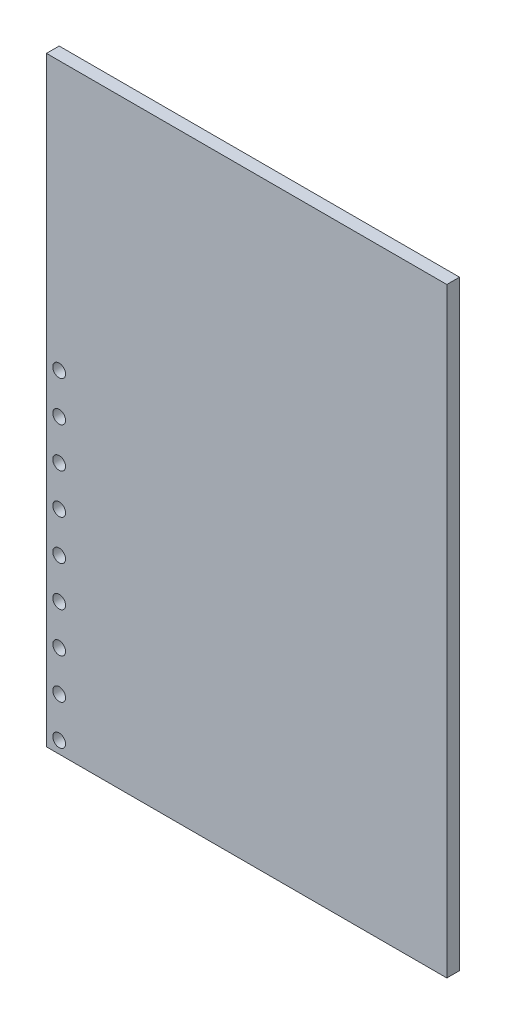
ISO-10303-21;
HEADER;
FILE_DESCRIPTION(('STEP AP214'),'2;1');
FILE_NAME('part.step','',(''),(''),'','','');
FILE_SCHEMA(('AUTOMOTIVE_DESIGN { 1 0 10303 214 1 1 1 1 }'));
ENDSEC;
DATA;
#1=APPLICATION_CONTEXT('core data for automotive mechanical design processes');
#2=APPLICATION_PROTOCOL_DEFINITION('international standard','automotive_design',2000,#1);
#3=PRODUCT_CONTEXT('',#1,'mechanical');
#4=PRODUCT('Part','Part','',(#3));
#5=PRODUCT_RELATED_PRODUCT_CATEGORY('part','',(#4));
#6=PRODUCT_DEFINITION_FORMATION('','',#4);
#7=PRODUCT_DEFINITION_CONTEXT('part definition',#1,'design');
#8=PRODUCT_DEFINITION('design','',#6,#7);
#9=PRODUCT_DEFINITION_SHAPE('','',#8);
#10=(LENGTH_UNIT() NAMED_UNIT(*) SI_UNIT(.MILLI.,.METRE.));
#11=(NAMED_UNIT(*) PLANE_ANGLE_UNIT() SI_UNIT($,.RADIAN.));
#12=(NAMED_UNIT(*) SI_UNIT($,.STERADIAN.) SOLID_ANGLE_UNIT());
#13=UNCERTAINTY_MEASURE_WITH_UNIT(LENGTH_MEASURE(1.E-05),#10,'distance_accuracy_value','');
#14=(GEOMETRIC_REPRESENTATION_CONTEXT(3) GLOBAL_UNCERTAINTY_ASSIGNED_CONTEXT((#13)) GLOBAL_UNIT_ASSIGNED_CONTEXT((#10,
#11,#12)) REPRESENTATION_CONTEXT('',''));
#15=CARTESIAN_POINT('',(0.,0.,0.));
#16=DIRECTION('',(0.,0.,1.));
#17=DIRECTION('',(1.,0.,0.));
#18=AXIS2_PLACEMENT_3D('',#15,#16,#17);
#19=CARTESIAN_POINT('',(0.,150.,0.));
#20=DIRECTION('',(1.,0.,0.));
#21=DIRECTION('',(0.,0.,-1.));
#22=AXIS2_PLACEMENT_3D('',#19,#20,#21);
#23=PLANE('',#22);
#24=DIRECTION('',(0.,0.,1.));
#25=VECTOR('',#24,1.);
#26=CARTESIAN_POINT('',(0.,0.,0.));
#27=LINE('',#26,#25);
#28=CARTESIAN_POINT('',(0.,0.,-3.175));
#29=VERTEX_POINT('',#28);
#30=CARTESIAN_POINT('',(0.,0.,0.));
#31=VERTEX_POINT('',#30);
#32=EDGE_CURVE('E110',#29,#31,#27,.T.);
#33=ORIENTED_EDGE('',*,*,#32,.T.);
#34=DIRECTION('',(0.,-1.,0.));
#35=VECTOR('',#34,1.);
#36=CARTESIAN_POINT('',(0.,150.,0.));
#37=LINE('',#36,#35);
#38=CARTESIAN_POINT('',(0.,150.,0.));
#39=VERTEX_POINT('',#38);
#40=EDGE_CURVE('E11',#39,#31,#37,.T.);
#41=ORIENTED_EDGE('',*,*,#40,.F.);
#42=DIRECTION('',(0.,0.,1.));
#43=VECTOR('',#42,1.);
#44=CARTESIAN_POINT('',(0.,150.,0.));
#45=LINE('',#44,#43);
#46=CARTESIAN_POINT('',(0.,150.,-3.175));
#47=VERTEX_POINT('',#46);
#48=EDGE_CURVE('E93',#47,#39,#45,.T.);
#49=ORIENTED_EDGE('',*,*,#48,.F.);
#50=DIRECTION('',(0.,-1.,0.));
#51=VECTOR('',#50,1.);
#52=CARTESIAN_POINT('',(0.,150.,-3.175));
#53=LINE('',#52,#51);
#54=EDGE_CURVE('E106',#47,#29,#53,.T.);
#55=ORIENTED_EDGE('',*,*,#54,.T.);
#56=EDGE_LOOP('',(#33,#41,#49,#55));
#57=FACE_BOUND('',#56,.T.);
#58=ADVANCED_FACE('F39',(#57),#23,.F.);
#59=CARTESIAN_POINT('',(0.,150.,0.));
#60=DIRECTION('',(0.,0.,-1.));
#61=DIRECTION('',(-1.,0.,0.));
#62=AXIS2_PLACEMENT_3D('',#59,#60,#61);
#63=PLANE('',#62);
#64=CARTESIAN_POINT('',(3.175,3.,0.));
#65=DIRECTION('',(0.,0.,1.));
#66=DIRECTION('',(1.,0.,0.));
#67=AXIS2_PLACEMENT_3D('',#64,#65,#66);
#68=CIRCLE('',#67,1.6);
#69=CARTESIAN_POINT('',(4.775,3.,0.));
#70=VERTEX_POINT('',#69);
#71=EDGE_CURVE('E174',#70,#70,#68,.T.);
#72=ORIENTED_EDGE('',*,*,#71,.F.);
#73=EDGE_LOOP('',(#72));
#74=FACE_BOUND('',#73,.T.);
#75=CARTESIAN_POINT('',(3.175,13.,0.));
#76=DIRECTION('',(0.,0.,-1.));
#77=DIRECTION('',(-1.,0.,0.));
#78=AXIS2_PLACEMENT_3D('',#75,#76,#77);
#79=CIRCLE('',#78,1.6);
#80=CARTESIAN_POINT('',(1.575,13.,0.));
#81=VERTEX_POINT('',#80);
#82=EDGE_CURVE('E161',#81,#81,#79,.T.);
#83=ORIENTED_EDGE('',*,*,#82,.T.);
#84=EDGE_LOOP('',(#83));
#85=FACE_BOUND('',#84,.T.);
#86=CARTESIAN_POINT('',(3.175,23.,0.));
#87=DIRECTION('',(0.,0.,1.));
#88=DIRECTION('',(1.,0.,0.));
#89=AXIS2_PLACEMENT_3D('',#86,#87,#88);
#90=CIRCLE('',#89,1.6);
#91=CARTESIAN_POINT('',(4.775,23.,0.));
#92=VERTEX_POINT('',#91);
#93=EDGE_CURVE('E157',#92,#92,#90,.T.);
#94=ORIENTED_EDGE('',*,*,#93,.F.);
#95=EDGE_LOOP('',(#94));
#96=FACE_BOUND('',#95,.T.);
#97=CARTESIAN_POINT('',(3.175,33.,0.));
#98=DIRECTION('',(0.,0.,-1.));
#99=DIRECTION('',(-1.,0.,0.));
#100=AXIS2_PLACEMENT_3D('',#97,#98,#99);
#101=CIRCLE('',#100,1.6);
#102=CARTESIAN_POINT('',(1.575,33.,0.));
#103=VERTEX_POINT('',#102);
#104=EDGE_CURVE('E153',#103,#103,#101,.T.);
#105=ORIENTED_EDGE('',*,*,#104,.T.);
#106=EDGE_LOOP('',(#105));
#107=FACE_BOUND('',#106,.T.);
#108=CARTESIAN_POINT('',(3.17499999999999,43.,0.));
#109=DIRECTION('',(0.,0.,1.));
#110=DIRECTION('',(1.,0.,0.));
#111=AXIS2_PLACEMENT_3D('',#108,#109,#110);
#112=CIRCLE('',#111,1.6);
#113=CARTESIAN_POINT('',(4.77499999999999,43.,0.));
#114=VERTEX_POINT('',#113);
#115=EDGE_CURVE('E148',#114,#114,#112,.T.);
#116=ORIENTED_EDGE('',*,*,#115,.F.);
#117=EDGE_LOOP('',(#116));
#118=FACE_BOUND('',#117,.T.);
#119=CARTESIAN_POINT('',(3.17499999999999,63.,0.));
#120=DIRECTION('',(0.,0.,-1.));
#121=DIRECTION('',(-1.,0.,0.));
#122=AXIS2_PLACEMENT_3D('',#119,#120,#121);
#123=CIRCLE('',#122,1.6);
#124=CARTESIAN_POINT('',(1.57499999999999,63.,0.));
#125=VERTEX_POINT('',#124);
#126=EDGE_CURVE('E143',#125,#125,#123,.T.);
#127=ORIENTED_EDGE('',*,*,#126,.T.);
#128=EDGE_LOOP('',(#127));
#129=FACE_BOUND('',#128,.T.);
#130=CARTESIAN_POINT('',(3.17499999999999,53.,0.));
#131=DIRECTION('',(0.,0.,1.));
#132=DIRECTION('',(1.,0.,0.));
#133=AXIS2_PLACEMENT_3D('',#130,#131,#132);
#134=CIRCLE('',#133,1.6);
#135=CARTESIAN_POINT('',(4.77499999999999,53.,0.));
#136=VERTEX_POINT('',#135);
#137=EDGE_CURVE('E138',#136,#136,#134,.T.);
#138=ORIENTED_EDGE('',*,*,#137,.F.);
#139=EDGE_LOOP('',(#138));
#140=FACE_BOUND('',#139,.T.);
#141=CARTESIAN_POINT('',(3.175,73.,0.));
#142=DIRECTION('',(0.,0.,-1.));
#143=DIRECTION('',(-1.,0.,0.));
#144=AXIS2_PLACEMENT_3D('',#141,#142,#143);
#145=CIRCLE('',#144,1.6);
#146=CARTESIAN_POINT('',(1.575,73.,0.));
#147=VERTEX_POINT('',#146);
#148=EDGE_CURVE('E133',#147,#147,#145,.T.);
#149=ORIENTED_EDGE('',*,*,#148,.T.);
#150=EDGE_LOOP('',(#149));
#151=FACE_BOUND('',#150,.T.);
#152=CARTESIAN_POINT('',(3.175,83.,0.));
#153=DIRECTION('',(0.,0.,1.));
#154=DIRECTION('',(1.,0.,0.));
#155=AXIS2_PLACEMENT_3D('',#152,#153,#154);
#156=CIRCLE('',#155,1.6);
#157=CARTESIAN_POINT('',(4.775,83.,0.));
#158=VERTEX_POINT('',#157);
#159=EDGE_CURVE('E128',#158,#158,#156,.T.);
#160=ORIENTED_EDGE('',*,*,#159,.F.);
#161=EDGE_LOOP('',(#160));
#162=FACE_BOUND('',#161,.T.);
#163=DIRECTION('',(1.,0.,0.));
#164=VECTOR('',#163,1.);
#165=CARTESIAN_POINT('',(0.,0.,0.));
#166=LINE('',#165,#164);
#167=CARTESIAN_POINT('',(100.,0.,0.));
#168=VERTEX_POINT('',#167);
#169=EDGE_CURVE('E98',#31,#168,#166,.T.);
#170=ORIENTED_EDGE('',*,*,#169,.T.);
#171=DIRECTION('',(0.,-1.,0.));
#172=VECTOR('',#171,1.);
#173=CARTESIAN_POINT('',(100.,150.,0.));
#174=LINE('',#173,#172);
#175=CARTESIAN_POINT('',(100.,150.,0.));
#176=VERTEX_POINT('',#175);
#177=EDGE_CURVE('E49',#176,#168,#174,.T.);
#178=ORIENTED_EDGE('',*,*,#177,.F.);
#179=DIRECTION('',(1.,0.,0.));
#180=VECTOR('',#179,1.);
#181=CARTESIAN_POINT('',(0.,150.,0.));
#182=LINE('',#181,#180);
#183=EDGE_CURVE('E88',#39,#176,#182,.T.);
#184=ORIENTED_EDGE('',*,*,#183,.F.);
#185=ORIENTED_EDGE('',*,*,#40,.T.);
#186=EDGE_LOOP('',(#170,#178,#184,#185));
#187=FACE_BOUND('',#186,.T.);
#188=ADVANCED_FACE('F97',(#74,#85,#96,#107,#118,#129,#140,#151,#162,#187),#63,.F.);
#189=CARTESIAN_POINT('',(100.,150.,0.));
#190=DIRECTION('',(-1.,0.,0.));
#191=DIRECTION('',(0.,0.,1.));
#192=AXIS2_PLACEMENT_3D('',#189,#190,#191);
#193=PLANE('',#192);
#194=DIRECTION('',(0.,0.,-1.));
#195=VECTOR('',#194,1.);
#196=CARTESIAN_POINT('',(100.,0.,0.));
#197=LINE('',#196,#195);
#198=CARTESIAN_POINT('',(100.,0.,-3.175));
#199=VERTEX_POINT('',#198);
#200=EDGE_CURVE('E75',#168,#199,#197,.T.);
#201=ORIENTED_EDGE('',*,*,#200,.T.);
#202=DIRECTION('',(0.,-1.,0.));
#203=VECTOR('',#202,1.);
#204=CARTESIAN_POINT('',(100.,150.,-3.175));
#205=LINE('',#204,#203);
#206=CARTESIAN_POINT('',(100.,150.,-3.175));
#207=VERTEX_POINT('',#206);
#208=EDGE_CURVE('E100',#207,#199,#205,.T.);
#209=ORIENTED_EDGE('',*,*,#208,.F.);
#210=DIRECTION('',(0.,0.,-1.));
#211=VECTOR('',#210,1.);
#212=CARTESIAN_POINT('',(100.,150.,0.));
#213=LINE('',#212,#211);
#214=EDGE_CURVE('E91',#176,#207,#213,.T.);
#215=ORIENTED_EDGE('',*,*,#214,.F.);
#216=ORIENTED_EDGE('',*,*,#177,.T.);
#217=EDGE_LOOP('',(#201,#209,#215,#216));
#218=FACE_BOUND('',#217,.T.);
#219=ADVANCED_FACE('F102',(#218),#193,.F.);
#220=CARTESIAN_POINT('',(0.,150.,-3.175));
#221=DIRECTION('',(0.,0.,1.));
#222=DIRECTION('',(1.,0.,0.));
#223=AXIS2_PLACEMENT_3D('',#220,#221,#222);
#224=PLANE('',#223);
#225=CARTESIAN_POINT('',(3.175,3.,-3.175));
#226=DIRECTION('',(0.,0.,1.));
#227=DIRECTION('',(1.,0.,0.));
#228=AXIS2_PLACEMENT_3D('',#225,#226,#227);
#229=CIRCLE('',#228,1.6);
#230=CARTESIAN_POINT('',(4.775,3.,-3.175));
#231=VERTEX_POINT('',#230);
#232=EDGE_CURVE('E42',#231,#231,#229,.T.);
#233=ORIENTED_EDGE('',*,*,#232,.T.);
#234=EDGE_LOOP('',(#233));
#235=FACE_BOUND('',#234,.T.);
#236=CARTESIAN_POINT('',(3.175,13.,-3.175));
#237=DIRECTION('',(0.,0.,1.));
#238=DIRECTION('',(1.,0.,0.));
#239=AXIS2_PLACEMENT_3D('',#236,#237,#238);
#240=CIRCLE('',#239,1.6);
#241=CARTESIAN_POINT('',(4.775,13.,-3.175));
#242=VERTEX_POINT('',#241);
#243=EDGE_CURVE('E158',#242,#242,#240,.F.);
#244=ORIENTED_EDGE('',*,*,#243,.F.);
#245=EDGE_LOOP('',(#244));
#246=FACE_BOUND('',#245,.T.);
#247=CARTESIAN_POINT('',(3.175,23.,-3.175));
#248=DIRECTION('',(0.,0.,1.));
#249=DIRECTION('',(1.,0.,0.));
#250=AXIS2_PLACEMENT_3D('',#247,#248,#249);
#251=CIRCLE('',#250,1.6);
#252=CARTESIAN_POINT('',(4.775,23.,-3.175));
#253=VERTEX_POINT('',#252);
#254=EDGE_CURVE('E154',#253,#253,#251,.T.);
#255=ORIENTED_EDGE('',*,*,#254,.T.);
#256=EDGE_LOOP('',(#255));
#257=FACE_BOUND('',#256,.T.);
#258=CARTESIAN_POINT('',(3.175,33.,-3.175));
#259=DIRECTION('',(0.,0.,1.));
#260=DIRECTION('',(1.,0.,0.));
#261=AXIS2_PLACEMENT_3D('',#258,#259,#260);
#262=CIRCLE('',#261,1.6);
#263=CARTESIAN_POINT('',(4.775,33.,-3.175));
#264=VERTEX_POINT('',#263);
#265=EDGE_CURVE('E149',#264,#264,#262,.F.);
#266=ORIENTED_EDGE('',*,*,#265,.F.);
#267=EDGE_LOOP('',(#266));
#268=FACE_BOUND('',#267,.T.);
#269=CARTESIAN_POINT('',(3.17499999999999,43.,-3.175));
#270=DIRECTION('',(0.,0.,1.));
#271=DIRECTION('',(1.,0.,0.));
#272=AXIS2_PLACEMENT_3D('',#269,#270,#271);
#273=CIRCLE('',#272,1.6);
#274=CARTESIAN_POINT('',(4.77499999999999,43.,-3.175));
#275=VERTEX_POINT('',#274);
#276=EDGE_CURVE('E144',#275,#275,#273,.T.);
#277=ORIENTED_EDGE('',*,*,#276,.T.);
#278=EDGE_LOOP('',(#277));
#279=FACE_BOUND('',#278,.T.);
#280=CARTESIAN_POINT('',(3.17499999999999,63.,-3.175));
#281=DIRECTION('',(0.,0.,1.));
#282=DIRECTION('',(1.,0.,0.));
#283=AXIS2_PLACEMENT_3D('',#280,#281,#282);
#284=CIRCLE('',#283,1.6);
#285=CARTESIAN_POINT('',(4.775,63.,-3.175));
#286=VERTEX_POINT('',#285);
#287=EDGE_CURVE('E139',#286,#286,#284,.F.);
#288=ORIENTED_EDGE('',*,*,#287,.F.);
#289=EDGE_LOOP('',(#288));
#290=FACE_BOUND('',#289,.T.);
#291=CARTESIAN_POINT('',(3.17499999999999,53.,-3.175));
#292=DIRECTION('',(0.,0.,1.));
#293=DIRECTION('',(1.,0.,0.));
#294=AXIS2_PLACEMENT_3D('',#291,#292,#293);
#295=CIRCLE('',#294,1.6);
#296=CARTESIAN_POINT('',(4.77499999999999,53.,-3.175));
#297=VERTEX_POINT('',#296);
#298=EDGE_CURVE('E134',#297,#297,#295,.T.);
#299=ORIENTED_EDGE('',*,*,#298,.T.);
#300=EDGE_LOOP('',(#299));
#301=FACE_BOUND('',#300,.T.);
#302=CARTESIAN_POINT('',(3.175,73.,-3.175));
#303=DIRECTION('',(0.,0.,1.));
#304=DIRECTION('',(1.,0.,0.));
#305=AXIS2_PLACEMENT_3D('',#302,#303,#304);
#306=CIRCLE('',#305,1.6);
#307=CARTESIAN_POINT('',(4.775,73.,-3.175));
#308=VERTEX_POINT('',#307);
#309=EDGE_CURVE('E129',#308,#308,#306,.F.);
#310=ORIENTED_EDGE('',*,*,#309,.F.);
#311=EDGE_LOOP('',(#310));
#312=FACE_BOUND('',#311,.T.);
#313=CARTESIAN_POINT('',(3.175,83.,-3.175));
#314=DIRECTION('',(0.,0.,1.));
#315=DIRECTION('',(1.,0.,0.));
#316=AXIS2_PLACEMENT_3D('',#313,#314,#315);
#317=CIRCLE('',#316,1.6);
#318=CARTESIAN_POINT('',(4.775,83.,-3.175));
#319=VERTEX_POINT('',#318);
#320=EDGE_CURVE('E114',#319,#319,#317,.T.);
#321=ORIENTED_EDGE('',*,*,#320,.T.);
#322=EDGE_LOOP('',(#321));
#323=FACE_BOUND('',#322,.T.);
#324=DIRECTION('',(-1.,0.,0.));
#325=VECTOR('',#324,1.);
#326=CARTESIAN_POINT('',(0.,0.,-3.175));
#327=LINE('',#326,#325);
#328=EDGE_CURVE('E81',#199,#29,#327,.T.);
#329=ORIENTED_EDGE('',*,*,#328,.T.);
#330=ORIENTED_EDGE('',*,*,#54,.F.);
#331=DIRECTION('',(-1.,0.,0.));
#332=VECTOR('',#331,1.);
#333=CARTESIAN_POINT('',(0.,150.,-3.175));
#334=LINE('',#333,#332);
#335=EDGE_CURVE('E58',#207,#47,#334,.T.);
#336=ORIENTED_EDGE('',*,*,#335,.F.);
#337=ORIENTED_EDGE('',*,*,#208,.T.);
#338=EDGE_LOOP('',(#329,#330,#336,#337));
#339=FACE_BOUND('',#338,.T.);
#340=ADVANCED_FACE('F206',(#235,#246,#257,#268,#279,#290,#301,#312,#323,#339),#224,.F.);
#341=CARTESIAN_POINT('',(0.,150.,0.));
#342=DIRECTION('',(0.,-1.,0.));
#343=DIRECTION('',(0.,0.,-1.));
#344=AXIS2_PLACEMENT_3D('',#341,#342,#343);
#345=PLANE('',#344);
#346=ORIENTED_EDGE('',*,*,#48,.T.);
#347=ORIENTED_EDGE('',*,*,#183,.T.);
#348=ORIENTED_EDGE('',*,*,#214,.T.);
#349=ORIENTED_EDGE('',*,*,#335,.T.);
#350=EDGE_LOOP('',(#346,#347,#348,#349));
#351=FACE_BOUND('',#350,.T.);
#352=ADVANCED_FACE('F89',(#351),#345,.F.);
#353=CARTESIAN_POINT('',(0.,0.,0.));
#354=DIRECTION('',(0.,-1.,0.));
#355=DIRECTION('',(0.,0.,-1.));
#356=AXIS2_PLACEMENT_3D('',#353,#354,#355);
#357=PLANE('',#356);
#358=ORIENTED_EDGE('',*,*,#32,.F.);
#359=ORIENTED_EDGE('',*,*,#328,.F.);
#360=ORIENTED_EDGE('',*,*,#200,.F.);
#361=ORIENTED_EDGE('',*,*,#169,.F.);
#362=EDGE_LOOP('',(#358,#359,#360,#361));
#363=FACE_BOUND('',#362,.T.);
#364=ADVANCED_FACE('F214',(#363),#357,.T.);
#365=CARTESIAN_POINT('',(3.175,83.,-5.));
#366=DIRECTION('',(0.,0.,1.));
#367=DIRECTION('',(1.,0.,0.));
#368=AXIS2_PLACEMENT_3D('',#365,#366,#367);
#369=CYLINDRICAL_SURFACE('',#368,1.6);
#370=ORIENTED_EDGE('',*,*,#159,.T.);
#371=EDGE_LOOP('',(#370));
#372=FACE_BOUND('',#371,.T.);
#373=ORIENTED_EDGE('',*,*,#320,.F.);
#374=EDGE_LOOP('',(#373));
#375=FACE_BOUND('',#374,.T.);
#376=ADVANCED_FACE('F197',(#372,#375),#369,.F.);
#377=CARTESIAN_POINT('',(3.175,73.,-5.));
#378=DIRECTION('',(0.,0.,1.));
#379=DIRECTION('',(1.,0.,0.));
#380=AXIS2_PLACEMENT_3D('',#377,#378,#379);
#381=CYLINDRICAL_SURFACE('',#380,1.6);
#382=ORIENTED_EDGE('',*,*,#148,.F.);
#383=EDGE_LOOP('',(#382));
#384=FACE_BOUND('',#383,.T.);
#385=ORIENTED_EDGE('',*,*,#309,.T.);
#386=EDGE_LOOP('',(#385));
#387=FACE_BOUND('',#386,.T.);
#388=ADVANCED_FACE('F222',(#384,#387),#381,.F.);
#389=CARTESIAN_POINT('',(3.17499999999999,53.,-5.));
#390=DIRECTION('',(0.,0.,1.));
#391=DIRECTION('',(1.,0.,0.));
#392=AXIS2_PLACEMENT_3D('',#389,#390,#391);
#393=CYLINDRICAL_SURFACE('',#392,1.6);
#394=ORIENTED_EDGE('',*,*,#137,.T.);
#395=EDGE_LOOP('',(#394));
#396=FACE_BOUND('',#395,.T.);
#397=ORIENTED_EDGE('',*,*,#298,.F.);
#398=EDGE_LOOP('',(#397));
#399=FACE_BOUND('',#398,.T.);
#400=ADVANCED_FACE('F225',(#396,#399),#393,.F.);
#401=CARTESIAN_POINT('',(3.17499999999999,63.,-5.));
#402=DIRECTION('',(0.,0.,1.));
#403=DIRECTION('',(1.,0.,0.));
#404=AXIS2_PLACEMENT_3D('',#401,#402,#403);
#405=CYLINDRICAL_SURFACE('',#404,1.6);
#406=ORIENTED_EDGE('',*,*,#126,.F.);
#407=EDGE_LOOP('',(#406));
#408=FACE_BOUND('',#407,.T.);
#409=ORIENTED_EDGE('',*,*,#287,.T.);
#410=EDGE_LOOP('',(#409));
#411=FACE_BOUND('',#410,.T.);
#412=ADVANCED_FACE('F229',(#408,#411),#405,.F.);
#413=CARTESIAN_POINT('',(3.17499999999999,43.,-5.));
#414=DIRECTION('',(0.,0.,1.));
#415=DIRECTION('',(1.,0.,0.));
#416=AXIS2_PLACEMENT_3D('',#413,#414,#415);
#417=CYLINDRICAL_SURFACE('',#416,1.6);
#418=ORIENTED_EDGE('',*,*,#115,.T.);
#419=EDGE_LOOP('',(#418));
#420=FACE_BOUND('',#419,.T.);
#421=ORIENTED_EDGE('',*,*,#276,.F.);
#422=EDGE_LOOP('',(#421));
#423=FACE_BOUND('',#422,.T.);
#424=ADVANCED_FACE('F233',(#420,#423),#417,.F.);
#425=CARTESIAN_POINT('',(3.175,33.,-5.));
#426=DIRECTION('',(0.,0.,1.));
#427=DIRECTION('',(1.,0.,0.));
#428=AXIS2_PLACEMENT_3D('',#425,#426,#427);
#429=CYLINDRICAL_SURFACE('',#428,1.6);
#430=ORIENTED_EDGE('',*,*,#104,.F.);
#431=EDGE_LOOP('',(#430));
#432=FACE_BOUND('',#431,.T.);
#433=ORIENTED_EDGE('',*,*,#265,.T.);
#434=EDGE_LOOP('',(#433));
#435=FACE_BOUND('',#434,.T.);
#436=ADVANCED_FACE('F237',(#432,#435),#429,.F.);
#437=CARTESIAN_POINT('',(3.175,23.,-5.));
#438=DIRECTION('',(0.,0.,1.));
#439=DIRECTION('',(1.,0.,0.));
#440=AXIS2_PLACEMENT_3D('',#437,#438,#439);
#441=CYLINDRICAL_SURFACE('',#440,1.6);
#442=ORIENTED_EDGE('',*,*,#93,.T.);
#443=EDGE_LOOP('',(#442));
#444=FACE_BOUND('',#443,.T.);
#445=ORIENTED_EDGE('',*,*,#254,.F.);
#446=EDGE_LOOP('',(#445));
#447=FACE_BOUND('',#446,.T.);
#448=ADVANCED_FACE('F241',(#444,#447),#441,.F.);
#449=CARTESIAN_POINT('',(3.175,13.,-5.));
#450=DIRECTION('',(0.,0.,1.));
#451=DIRECTION('',(1.,0.,0.));
#452=AXIS2_PLACEMENT_3D('',#449,#450,#451);
#453=CYLINDRICAL_SURFACE('',#452,1.6);
#454=ORIENTED_EDGE('',*,*,#82,.F.);
#455=EDGE_LOOP('',(#454));
#456=FACE_BOUND('',#455,.T.);
#457=ORIENTED_EDGE('',*,*,#243,.T.);
#458=EDGE_LOOP('',(#457));
#459=FACE_BOUND('',#458,.T.);
#460=ADVANCED_FACE('F245',(#456,#459),#453,.F.);
#461=CARTESIAN_POINT('',(3.175,3.,-5.));
#462=DIRECTION('',(0.,0.,1.));
#463=DIRECTION('',(1.,0.,0.));
#464=AXIS2_PLACEMENT_3D('',#461,#462,#463);
#465=CYLINDRICAL_SURFACE('',#464,1.6);
#466=ORIENTED_EDGE('',*,*,#71,.T.);
#467=EDGE_LOOP('',(#466));
#468=FACE_BOUND('',#467,.T.);
#469=ORIENTED_EDGE('',*,*,#232,.F.);
#470=EDGE_LOOP('',(#469));
#471=FACE_BOUND('',#470,.T.);
#472=ADVANCED_FACE('F249',(#468,#471),#465,.F.);
#473=CLOSED_SHELL('',(#58,#188,#219,#340,#352,#364,#376,#388,#400,#412,#424,#436,#448,#460,#472));
#474=MANIFOLD_SOLID_BREP('B2',#473);
#475=ADVANCED_BREP_SHAPE_REPRESENTATION('',(#18,#474),#14);
#476=SHAPE_DEFINITION_REPRESENTATION(#9,#475);
ENDSEC;
END-ISO-10303-21;
